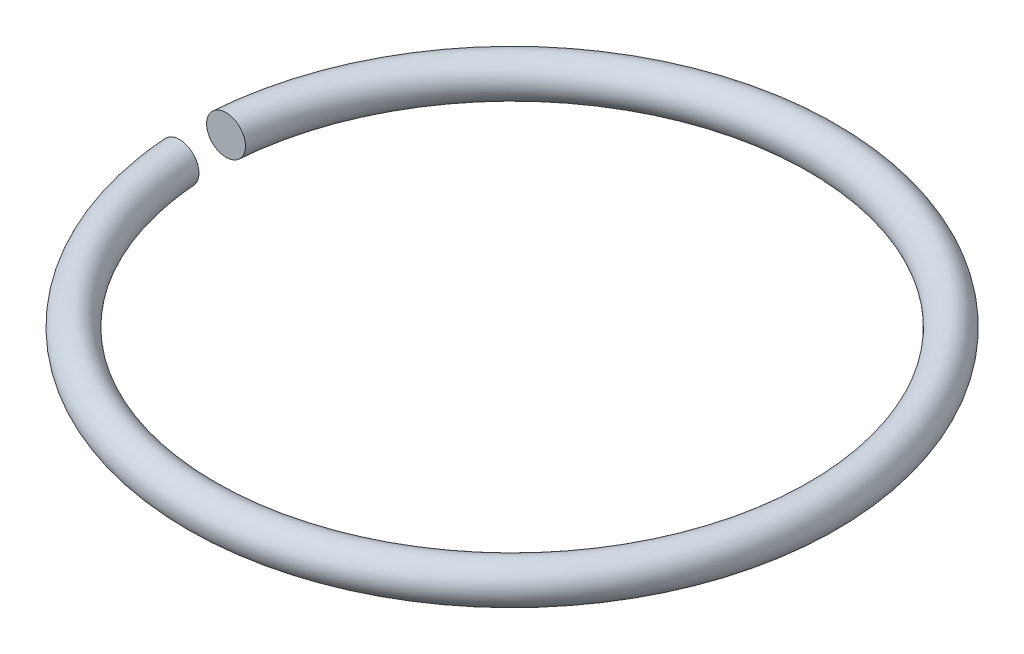
ISO-10303-21;
HEADER;
FILE_DESCRIPTION(('STEP AP214'),'2;1');
FILE_NAME('part.step','',(''),(''),'','','');
FILE_SCHEMA(('AUTOMOTIVE_DESIGN { 1 0 10303 214 1 1 1 1 }'));
ENDSEC;
DATA;
#1=APPLICATION_CONTEXT('core data for automotive mechanical design processes');
#2=APPLICATION_PROTOCOL_DEFINITION('international standard','automotive_design',2000,#1);
#3=PRODUCT_CONTEXT('',#1,'mechanical');
#4=PRODUCT('Part','Part','',(#3));
#5=PRODUCT_RELATED_PRODUCT_CATEGORY('part','',(#4));
#6=PRODUCT_DEFINITION_FORMATION('','',#4);
#7=PRODUCT_DEFINITION_CONTEXT('part definition',#1,'design');
#8=PRODUCT_DEFINITION('design','',#6,#7);
#9=PRODUCT_DEFINITION_SHAPE('','',#8);
#10=(LENGTH_UNIT() NAMED_UNIT(*) SI_UNIT(.MILLI.,.METRE.));
#11=(NAMED_UNIT(*) PLANE_ANGLE_UNIT() SI_UNIT($,.RADIAN.));
#12=(NAMED_UNIT(*) SI_UNIT($,.STERADIAN.) SOLID_ANGLE_UNIT());
#13=UNCERTAINTY_MEASURE_WITH_UNIT(LENGTH_MEASURE(1.E-05),#10,'distance_accuracy_value','');
#14=(GEOMETRIC_REPRESENTATION_CONTEXT(3) GLOBAL_UNCERTAINTY_ASSIGNED_CONTEXT((#13)) GLOBAL_UNIT_ASSIGNED_CONTEXT((#10,
#11,#12)) REPRESENTATION_CONTEXT('',''));
#15=CARTESIAN_POINT('',(0.,0.,0.));
#16=DIRECTION('',(0.,0.,1.));
#17=DIRECTION('',(1.,0.,0.));
#18=AXIS2_PLACEMENT_3D('',#15,#16,#17);
#19=CARTESIAN_POINT('',(0.,1.25,0.));
#20=DIRECTION('',(0.,-1.,0.));
#21=DIRECTION('',(0.,0.,-1.));
#22=AXIS2_PLACEMENT_3D('',#19,#20,#21);
#23=TOROIDAL_SURFACE('',#22,20.,1.25);
#24=CARTESIAN_POINT('',(-21.000424206525,0.577884575749062,1.5));
#25=CARTESIAN_POINT('',(-21.0381789248792,0.636942041209721,1.5));
#26=CARTESIAN_POINT('',(-21.0709797923446,0.69922625283125,1.5));
#27=CARTESIAN_POINT('',(-21.125687678184,0.828468326381568,1.5));
#28=CARTESIAN_POINT('',(-21.1475818215021,0.895431606030261,1.5));
#29=CARTESIAN_POINT('',(-21.1798019621362,1.03206286796308,1.5));
#30=CARTESIAN_POINT('',(-21.1901328123784,1.10172970289795,1.5));
#31=CARTESIAN_POINT('',(-21.1989383293893,1.24179002963197,1.5));
#32=CARTESIAN_POINT('',(-21.1974159005558,1.3121833392022,1.5));
#33=CARTESIAN_POINT('',(-21.1825719991029,1.45166893669846,1.5));
#34=CARTESIAN_POINT('',(-21.169258122974,1.5207620330083,1.5));
#35=CARTESIAN_POINT('',(-21.131223723428,1.65573619137411,1.5));
#36=CARTESIAN_POINT('',(-21.1065027682545,1.72161713174605,1.5));
#37=CARTESIAN_POINT('',(-21.0463513355422,1.8483263452063,1.5));
#38=CARTESIAN_POINT('',(-21.0109164615403,1.90915253098533,1.5));
#39=CARTESIAN_POINT('',(-20.930355157593,2.02400632255512,1.5));
#40=CARTESIAN_POINT('',(-20.8852286709827,2.07803388859283,1.5));
#41=CARTESIAN_POINT('',(-20.7864812146393,2.17786359595733,1.5));
#42=CARTESIAN_POINT('',(-20.7328451177434,2.22365077334306,1.5));
#43=CARTESIAN_POINT('',(-20.6186636720357,2.3055973209147,1.5));
#44=CARTESIAN_POINT('',(-20.5581182450414,2.34175658214051,1.5));
#45=CARTESIAN_POINT('',(-20.4316740403709,2.40351750016214,1.5));
#46=CARTESIAN_POINT('',(-20.3657621924191,2.42909239806934,1.5));
#47=CARTESIAN_POINT('',(-20.2305860367626,2.46884166461495,1.5));
#48=CARTESIAN_POINT('',(-20.1613216800218,2.48301586644509,1.5));
#49=CARTESIAN_POINT('',(-20.0212396397448,2.49958999403553,1.5));
#50=CARTESIAN_POINT('',(-19.9504188079132,2.50196331814569,1.5));
#51=CARTESIAN_POINT('',(-19.8093818189281,2.49479961724253,1.5));
#52=CARTESIAN_POINT('',(-19.7391656665934,2.48526249740316,1.5));
#53=CARTESIAN_POINT('',(-19.6012580158585,2.45452988527954,1.5));
#54=CARTESIAN_POINT('',(-19.5335691277751,2.43332267670996,1.5));
#55=CARTESIAN_POINT('',(-19.4027164843872,2.37983628671145,1.5));
#56=CARTESIAN_POINT('',(-19.3395527232063,2.34755711966091,1.5));
#57=CARTESIAN_POINT('',(-19.2196038459625,2.27286451401278,1.5));
#58=CARTESIAN_POINT('',(-19.162813507989,2.23045946224962,1.5));
#59=CARTESIAN_POINT('',(-19.0571800623806,2.13669540678665,1.5));
#60=CARTESIAN_POINT('',(-19.0083368604824,2.08533650930592,1.5));
#61=CARTESIAN_POINT('',(-18.9201153224905,1.97525500353917,1.5));
#62=CARTESIAN_POINT('',(-18.8807140640709,1.91655076657305,1.5));
#63=CARTESIAN_POINT('',(-18.8123612931153,1.79334473651933,1.5));
#64=CARTESIAN_POINT('',(-18.7834096007691,1.72884304321501,1.5));
#65=CARTESIAN_POINT('',(-18.7368677774017,1.59608196798612,1.5));
#66=CARTESIAN_POINT('',(-18.7192436559254,1.52783450128098,1.5));
#67=CARTESIAN_POINT('',(-18.6957302311949,1.38934735865951,1.5));
#68=CARTESIAN_POINT('',(-18.6898407618401,1.31910771095623,1.5));
#69=CARTESIAN_POINT('',(-18.6899675066147,1.17878669302257,1.5));
#70=CARTESIAN_POINT('',(-18.6959588522613,1.10870529893519,1.5));
#71=CARTESIAN_POINT('',(-18.7196236657601,0.970543917220662,1.5));
#72=CARTESIAN_POINT('',(-18.737297097324,0.902463923377217,1.5));
#73=CARTESIAN_POINT('',(-18.7838131868777,0.770239687904588,1.5));
#74=CARTESIAN_POINT('',(-18.8126549934726,0.706095146697067,1.5));
#75=CARTESIAN_POINT('',(-18.880677724075,0.58354557536575,1.5));
#76=CARTESIAN_POINT('',(-18.9198587250329,0.525140587963553,1.5));
#77=CARTESIAN_POINT('',(-19.0075256244213,0.41560107330792,1.5));
#78=CARTESIAN_POINT('',(-19.0560297197722,0.364481110550033,1.5));
#79=CARTESIAN_POINT('',(-19.1609091257382,0.271079956041258,1.5));
#80=CARTESIAN_POINT('',(-19.217284574643,0.228798919611699,1.5));
#81=CARTESIAN_POINT('',(-19.3364868687199,0.154142062263012,1.5));
#82=CARTESIAN_POINT('',(-19.3993324922486,0.121796223780506,1.5));
#83=CARTESIAN_POINT('',(-19.5295525096213,0.0680835940754284,1.5));
#84=CARTESIAN_POINT('',(-19.5969269811005,0.0467169911177149,1.5));
#85=CARTESIAN_POINT('',(-19.7344774930703,0.0155182234375088,1.5));
#86=CARTESIAN_POINT('',(-19.8046602635758,0.00571572474169515,1.5));
#87=CARTESIAN_POINT('',(-19.9456733737142,-0.00197990065573556,1.5));
#88=CARTESIAN_POINT('',(-20.016503693115,0.00012660181754774,1.5));
#89=CARTESIAN_POINT('',(-20.1568690190593,0.0161980954788279,1.5));
#90=CARTESIAN_POINT('',(-20.2264028371312,0.0301734682755117,1.5));
#91=CARTESIAN_POINT('',(-20.3621524909742,0.069614612750059,1.5));
#92=CARTESIAN_POINT('',(-20.4283675067909,0.0950832085858128,1.5));
#93=CARTESIAN_POINT('',(-20.5555409637035,0.156778807368061,1.5));
#94=CARTESIAN_POINT('',(-20.6165014396958,0.193001621215678,1.5));
#95=CARTESIAN_POINT('',(-20.7314006348062,0.275166626815716,1.5));
#96=CARTESIAN_POINT('',(-20.7853477820006,0.321096975122866,1.5));
#97=CARTESIAN_POINT('',(-20.8661405796022,0.402603582157283,1.5));
#98=CARTESIAN_POINT('',(-20.8955864559425,0.435646182117044,1.5));
#99=CARTESIAN_POINT('',(-20.9508200562936,0.504659371310269,1.5));
#100=CARTESIAN_POINT('',(-20.9766077832665,0.540629958172817,1.5));
#101=CARTESIAN_POINT('',(-21.000424206525,0.577884575749062,1.5));
#102=B_SPLINE_CURVE_WITH_KNOTS('',3,(#24,#25,#26,#27,#28,#29,#30,#31,#32,#33,#34,#35,#36,#37,
#38,#39,#40,#41,#42,#43,#44,#45,#46,#47,#48,#49,#50,#51,#52,#53,#54,#55,#56,#57,#58,#59,#60,#61,
#62,#63,#64,#65,#66,#67,#68,#69,#70,#71,#72,#73,#74,#75,#76,#77,#78,#79,#80,#81,#82,#83,#84,#85,
#86,#87,#88,#89,#90,#91,#92,#93,#94,#95,#96,#97,#98,#99,#100,#101),.UNSPECIFIED.,.T.,.F.,(4,2,2,
2,2,2,2,2,2,2,2,2,2,2,2,2,2,2,2,2,2,2,2,2,2,2,2,2,2,2,2,2,2,2,2,2,2,2,4),(0.,0.210121660347751,
0.420490778594919,0.630771575198685,0.841000848519467,1.05109478273435,1.26119666962929,
1.47138488924247,1.68157433781594,1.89214170619172,2.10271145747862,2.31381035637128,
2.52491234388209,2.73648998443199,2.94806930948667,3.15986143997943,3.3716532954332,
3.58327033756969,3.79488486947323,4.00598033593611,4.21707216981224,4.42752758963883,
4.63798003050646,4.84799242507917,5.05800416728997,5.26799990289723,5.47799720146119,
5.68840861536299,5.89882372639186,6.10986772683284,6.32091534599965,6.53250320785982,
6.74408448128685,6.9558510140449,7.16766961122835,7.37940580656397,7.59088515417683,
7.72343416179667,7.85598306208694),.UNSPECIFIED.);
#103=CARTESIAN_POINT('',(-21.000424206525,0.577884575749062,1.5));
#104=VERTEX_POINT('',#103);
#105=EDGE_CURVE('E10',#104,#104,#102,.T.);
#106=ORIENTED_EDGE('',*,*,#105,.F.);
#107=EDGE_LOOP('',(#106));
#108=FACE_BOUND('',#107,.T.);
#109=CARTESIAN_POINT('',(-21.000424206525,0.577884575749059,-1.5));
#110=CARTESIAN_POINT('',(-20.9625431561387,0.518641126590695,-1.5));
#111=CARTESIAN_POINT('',(-20.9196212603596,0.462559114751096,-1.5));
#112=CARTESIAN_POINT('',(-20.8249282330605,0.358357441326104,-1.5));
#113=CARTESIAN_POINT('',(-20.7731462674871,0.310247671646379,-1.5));
#114=CARTESIAN_POINT('',(-20.6622694646217,0.223424463108698,-1.5));
#115=CARTESIAN_POINT('',(-20.6031789360515,0.184705527431584,-1.5));
#116=CARTESIAN_POINT('',(-20.4793624300146,0.117727692984261,-1.5));
#117=CARTESIAN_POINT('',(-20.4146378502967,0.0894662089142385,-1.5));
#118=CARTESIAN_POINT('',(-20.2812413903614,0.0441291151038464,-1.5));
#119=CARTESIAN_POINT('',(-20.2125620454171,0.027075466882438,-1.5));
#120=CARTESIAN_POINT('',(-20.0733140713649,0.00471573536096912,-1.5));
#121=CARTESIAN_POINT('',(-20.0027453445366,-0.000589739122026833,-1.5));
#122=CARTESIAN_POINT('',(-19.8615838242825,0.000695053963399696,-1.5));
#123=CARTESIAN_POINT('',(-19.7909912325237,0.00730758014428198,-1.5));
#124=CARTESIAN_POINT('',(-19.6519165818597,0.0322854745741541,-1.5));
#125=CARTESIAN_POINT('',(-19.5834345295944,0.0506508797937223,-1.5));
#126=CARTESIAN_POINT('',(-19.4505026172021,0.0986285934290851,-1.5));
#127=CARTESIAN_POINT('',(-19.3860541789678,0.12824484216828,-1.5));
#128=CARTESIAN_POINT('',(-19.2630543833064,0.197892554826,-1.5));
#129=CARTESIAN_POINT('',(-19.2045029820184,0.237923941270909,-1.5));
#130=CARTESIAN_POINT('',(-19.0950585765209,0.327206389652994,-1.5));
#131=CARTESIAN_POINT('',(-19.0441541302214,0.376443424354918,-1.5));
#132=CARTESIAN_POINT('',(-18.9513624380724,0.482786248898871,-1.5));
#133=CARTESIAN_POINT('',(-18.90947506919,0.539891931360272,-1.5));
#134=CARTESIAN_POINT('',(-18.8360343127642,0.660178973547487,-1.5));
#135=CARTESIAN_POINT('',(-18.8044520368819,0.723342695287222,-1.5));
#136=CARTESIAN_POINT('',(-18.7523747338636,0.854086366705867,-1.5));
#137=CARTESIAN_POINT('',(-18.7318795124811,0.921666238990007,-1.5));
#138=CARTESIAN_POINT('',(-18.7026142370334,1.05911774395855,-1.5));
#139=CARTESIAN_POINT('',(-18.6938110602184,1.12898232560304,-1.5));
#140=CARTESIAN_POINT('',(-18.6880773565125,1.2691966702979,-1.5));
#141=CARTESIAN_POINT('',(-18.6911467045247,1.33954642822832,-1.5));
#142=CARTESIAN_POINT('',(-18.7090558728007,1.47862963588552,-1.5));
#143=CARTESIAN_POINT('',(-18.7238790620738,1.54736522817753,-1.5));
#144=CARTESIAN_POINT('',(-18.7648463678639,1.68137502665741,-1.5));
#145=CARTESIAN_POINT('',(-18.7909904975549,1.7466492288172,-1.5));
#146=CARTESIAN_POINT('',(-18.853870453947,1.87194052058626,-1.5));
#147=CARTESIAN_POINT('',(-18.8906142760976,1.93195359695422,-1.5));
#148=CARTESIAN_POINT('',(-18.9736318806272,2.04497944182441,-1.5));
#149=CARTESIAN_POINT('',(-19.0199057782546,2.09799212565723,-1.5));
#150=CARTESIAN_POINT('',(-19.1207921869181,2.19565740717379,-1.5));
#151=CARTESIAN_POINT('',(-19.1754254061632,2.24028861275134,-1.5));
#152=CARTESIAN_POINT('',(-19.2913905536922,2.31977812309972,-1.5));
#153=CARTESIAN_POINT('',(-19.3527225915984,2.35463626790687,-1.5));
#154=CARTESIAN_POINT('',(-19.4805416961122,2.41369793628941,-1.5));
#155=CARTESIAN_POINT('',(-19.5470436281744,2.43786929038259,-1.5));
#156=CARTESIAN_POINT('',(-19.6831570793659,2.47473007465173,-1.5));
#157=CARTESIAN_POINT('',(-19.7527686403615,2.48741935019058,-1.5));
#158=CARTESIAN_POINT('',(-19.8932778090936,2.50097496716862,-1.5));
#159=CARTESIAN_POINT('',(-19.9641777553803,2.50181708117558,-1.5));
#160=CARTESIAN_POINT('',(-20.1051136186622,2.4915901395155,-1.5));
#161=CARTESIAN_POINT('',(-20.1751495329924,2.48052104711824,-1.5));
#162=CARTESIAN_POINT('',(-20.3123870193282,2.44677418935939,-1.5));
#163=CARTESIAN_POINT('',(-20.3795878229203,2.42409329839849,-1.5));
#164=CARTESIAN_POINT('',(-20.509219734378,2.36775519632184,-1.5));
#165=CARTESIAN_POINT('',(-20.5716508608079,2.33409802792966,-1.5));
#166=CARTESIAN_POINT('',(-20.689870319283,2.25681087424268,-1.5));
#167=CARTESIAN_POINT('',(-20.7456682302006,2.21319554200379,-1.5));
#168=CARTESIAN_POINT('',(-20.8491271984562,2.11719515621809,-1.5));
#169=CARTESIAN_POINT('',(-20.8967883408052,2.06481019430551,-1.5));
#170=CARTESIAN_POINT('',(-20.9824966459064,1.95289323943077,-1.5));
#171=CARTESIAN_POINT('',(-21.0205668482036,1.8933788907463,-1.5));
#172=CARTESIAN_POINT('',(-21.0861457182499,1.76879376064919,-1.5));
#173=CARTESIAN_POINT('',(-21.1136549471798,1.70372327469895,-1.5));
#174=CARTESIAN_POINT('',(-21.157264878689,1.57004619349764,-1.5));
#175=CARTESIAN_POINT('',(-21.1733939107532,1.50144883839338,-1.5));
#176=CARTESIAN_POINT('',(-21.1938912569971,1.36249992374562,-1.5));
#177=CARTESIAN_POINT('',(-21.1982567465715,1.2921479469828,-1.5));
#178=CARTESIAN_POINT('',(-21.1950983306144,1.15178540449714,-1.5));
#179=CARTESIAN_POINT('',(-21.1875857144563,1.08177457795466,-1.5));
#180=CARTESIAN_POINT('',(-21.1609095607626,0.944069592378901,-1.5));
#181=CARTESIAN_POINT('',(-21.1417601437088,0.876372730497084,-1.5));
#182=CARTESIAN_POINT('',(-21.1017759170976,0.770081712299426,-1.5));
#183=CARTESIAN_POINT('',(-21.0843287556512,0.730179267020138,-1.5));
#184=CARTESIAN_POINT('',(-21.0453724378106,0.652409280935978,-1.5));
#185=CARTESIAN_POINT('',(-21.0238632846039,0.614541738534257,-1.5));
#186=CARTESIAN_POINT('',(-21.000424206525,0.577884575749059,-1.5));
#187=B_SPLINE_CURVE_WITH_KNOTS('',3,(#109,#110,#111,#112,#113,#114,#115,#116,#117,#118,#119,
#120,#121,#122,#123,#124,#125,#126,#127,#128,#129,#130,#131,#132,#133,#134,#135,#136,#137,#138,
#139,#140,#141,#142,#143,#144,#145,#146,#147,#148,#149,#150,#151,#152,#153,#154,#155,#156,#157,
#158,#159,#160,#161,#162,#163,#164,#165,#166,#167,#168,#169,#170,#171,#172,#173,#174,#175,#176,
#177,#178,#179,#180,#181,#182,#183,#184,#185,#186),.UNSPECIFIED.,.T.,.F.,(4,2,2,2,2,2,2,2,2,2,2,
2,2,2,2,2,2,2,2,2,2,2,2,2,2,2,2,2,2,2,2,2,2,2,2,2,2,2,4),(0.,0.210797641363686,
0.421854911712966,0.632788342286575,0.843669590827676,1.05496283440118,1.26626702741457,
1.47796627099381,1.68966618051047,1.90144030102192,2.11321284628414,2.32466529193128,
2.53611485224809,2.74696645755381,2.9578143685929,3.16806367896892,3.37831077402227,
3.58826091156725,3.79821129342893,4.00832045884072,4.21843216528031,4.42907306187478,
4.63971740599969,4.85099158697928,5.06226861329216,5.27397763823157,5.48568731601345,
5.69745401061305,5.90921988095133,6.12067613156115,6.33213017279365,6.54307130452103,
6.75400122586965,6.96440419479881,7.17485768017617,7.38511126329681,7.5951102257515,
7.72554236006967,7.85597439203238),.UNSPECIFIED.);
#188=CARTESIAN_POINT('',(-21.000424206525,0.577884575749059,-1.5));
#189=VERTEX_POINT('',#188);
#190=EDGE_CURVE('E47',#189,#189,#187,.T.);
#191=ORIENTED_EDGE('',*,*,#190,.F.);
#192=EDGE_LOOP('',(#191));
#193=FACE_BOUND('',#192,.T.);
#194=ADVANCED_FACE('F37',(#108,#193),#23,.T.);
#195=CARTESIAN_POINT('',(-24.8397984938212,2.5,-1.5));
#196=DIRECTION('',(0.,0.,1.));
#197=DIRECTION('',(1.,0.,0.));
#198=AXIS2_PLACEMENT_3D('',#195,#196,#197);
#199=PLANE('',#198);
#200=ORIENTED_EDGE('',*,*,#190,.T.);
#201=EDGE_LOOP('',(#200));
#202=FACE_BOUND('',#201,.T.);
#203=ADVANCED_FACE('F57',(#202),#199,.T.);
#204=CARTESIAN_POINT('',(-24.8397984938212,2.5,1.5));
#205=DIRECTION('',(0.,0.,-1.));
#206=DIRECTION('',(-1.,0.,0.));
#207=AXIS2_PLACEMENT_3D('',#204,#205,#206);
#208=PLANE('',#207);
#209=ORIENTED_EDGE('',*,*,#105,.T.);
#210=EDGE_LOOP('',(#209));
#211=FACE_BOUND('',#210,.T.);
#212=ADVANCED_FACE('F60',(#211),#208,.T.);
#213=CLOSED_SHELL('',(#194,#203,#212));
#214=MANIFOLD_SOLID_BREP('B2',#213);
#215=ADVANCED_BREP_SHAPE_REPRESENTATION('',(#18,#214),#14);
#216=SHAPE_DEFINITION_REPRESENTATION(#9,#215);
ENDSEC;
END-ISO-10303-21;
